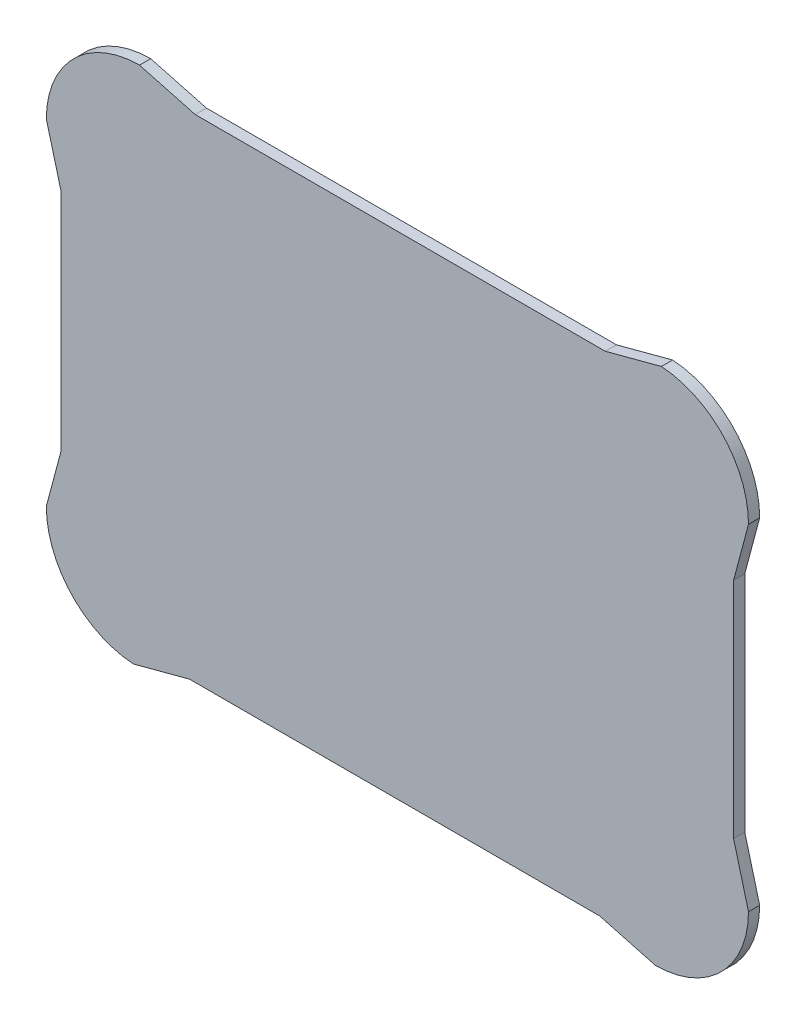
ISO-10303-21;
HEADER;
FILE_DESCRIPTION(('STEP AP214'),'2;1');
FILE_NAME('part.step','',(''),(''),'','','');
FILE_SCHEMA(('AUTOMOTIVE_DESIGN { 1 0 10303 214 1 1 1 1 }'));
ENDSEC;
DATA;
#1=APPLICATION_CONTEXT('core data for automotive mechanical design processes');
#2=APPLICATION_PROTOCOL_DEFINITION('international standard','automotive_design',2000,#1);
#3=PRODUCT_CONTEXT('',#1,'mechanical');
#4=PRODUCT('Part','Part','',(#3));
#5=PRODUCT_RELATED_PRODUCT_CATEGORY('part','',(#4));
#6=PRODUCT_DEFINITION_FORMATION('','',#4);
#7=PRODUCT_DEFINITION_CONTEXT('part definition',#1,'design');
#8=PRODUCT_DEFINITION('design','',#6,#7);
#9=PRODUCT_DEFINITION_SHAPE('','',#8);
#10=(LENGTH_UNIT() NAMED_UNIT(*) SI_UNIT(.MILLI.,.METRE.));
#11=(NAMED_UNIT(*) PLANE_ANGLE_UNIT() SI_UNIT($,.RADIAN.));
#12=(NAMED_UNIT(*) SI_UNIT($,.STERADIAN.) SOLID_ANGLE_UNIT());
#13=UNCERTAINTY_MEASURE_WITH_UNIT(LENGTH_MEASURE(1.E-05),#10,'distance_accuracy_value','');
#14=(GEOMETRIC_REPRESENTATION_CONTEXT(3) GLOBAL_UNCERTAINTY_ASSIGNED_CONTEXT((#13)) GLOBAL_UNIT_ASSIGNED_CONTEXT((#10,
#11,#12)) REPRESENTATION_CONTEXT('',''));
#15=CARTESIAN_POINT('',(0.,0.,0.));
#16=DIRECTION('',(0.,0.,1.));
#17=DIRECTION('',(1.,0.,0.));
#18=AXIS2_PLACEMENT_3D('',#15,#16,#17);
#19=CARTESIAN_POINT('',(-46.9702983450774,-73.8593226086013,6.));
#20=DIRECTION('',(0.,0.,-1.));
#21=DIRECTION('',(-1.,0.,0.));
#22=AXIS2_PLACEMENT_3D('',#19,#20,#21);
#23=CYLINDRICAL_SURFACE('',#22,50.);
#24=CARTESIAN_POINT('',(-46.9702983450774,-73.8593226086013,0.));
#25=DIRECTION('',(0.,0.,1.));
#26=DIRECTION('',(-1.,0.,0.));
#27=AXIS2_PLACEMENT_3D('',#24,#25,#26);
#28=CIRCLE('',#27,50.);
#29=CARTESIAN_POINT('',(-46.9694047117231,-123.859322600615,0.));
#30=VERTEX_POINT('',#29);
#31=CARTESIAN_POINT('',(3.02960538185109,-73.9574414033332,0.));
#32=VERTEX_POINT('',#31);
#33=EDGE_CURVE('E188',#30,#32,#28,.T.);
#34=ORIENTED_EDGE('',*,*,#33,.T.);
#35=DIRECTION('',(0.,0.,-1.));
#36=VECTOR('',#35,1.);
#37=CARTESIAN_POINT('',(3.02960538185109,-73.9574414033332,6.));
#38=LINE('',#37,#36);
#39=CARTESIAN_POINT('',(3.02960538185109,-73.9574414033332,6.));
#40=VERTEX_POINT('',#39);
#41=EDGE_CURVE('E11',#40,#32,#38,.T.);
#42=ORIENTED_EDGE('',*,*,#41,.F.);
#43=CARTESIAN_POINT('',(-46.9702983450774,-73.8593226086013,6.));
#44=DIRECTION('',(0.,0.,1.));
#45=DIRECTION('',(-1.,0.,0.));
#46=AXIS2_PLACEMENT_3D('',#43,#44,#45);
#47=CIRCLE('',#46,50.);
#48=CARTESIAN_POINT('',(-46.9694047117231,-123.859322600615,6.));
#49=VERTEX_POINT('',#48);
#50=EDGE_CURVE('E234',#49,#40,#47,.T.);
#51=ORIENTED_EDGE('',*,*,#50,.F.);
#52=DIRECTION('',(0.,0.,-1.));
#53=VECTOR('',#52,1.);
#54=CARTESIAN_POINT('',(-46.9694047117231,-123.859322600615,6.));
#55=LINE('',#54,#53);
#56=EDGE_CURVE('E184',#49,#30,#55,.T.);
#57=ORIENTED_EDGE('',*,*,#56,.T.);
#58=EDGE_LOOP('',(#34,#42,#51,#57));
#59=FACE_BOUND('',#58,.T.);
#60=ADVANCED_FACE('F39',(#59),#23,.T.);
#61=CARTESIAN_POINT('',(-4.97039461814889,-43.9574414033332,6.));
#62=DIRECTION('',(-0.966234939601246,-0.257662650560332,0.));
#63=DIRECTION('',(0.257662650560332,-0.966234939601247,0.));
#64=AXIS2_PLACEMENT_3D('',#61,#62,#63);
#65=PLANE('',#64);
#66=DIRECTION('',(-0.257662650560332,0.966234939601247,0.));
#67=VECTOR('',#66,1.);
#68=CARTESIAN_POINT('',(-4.97039461814889,-43.9574414033332,0.));
#69=LINE('',#68,#67);
#70=CARTESIAN_POINT('',(-4.97039461814889,-43.9574414033332,0.));
#71=VERTEX_POINT('',#70);
#72=EDGE_CURVE('E192',#32,#71,#69,.T.);
#73=ORIENTED_EDGE('',*,*,#72,.T.);
#74=DIRECTION('',(0.,0.,-1.));
#75=VECTOR('',#74,1.);
#76=CARTESIAN_POINT('',(-4.97039461814889,-43.9574414033332,6.));
#77=LINE('',#76,#75);
#78=CARTESIAN_POINT('',(-4.97039461814889,-43.9574414033332,6.));
#79=VERTEX_POINT('',#78);
#80=EDGE_CURVE('E48',#79,#71,#77,.T.);
#81=ORIENTED_EDGE('',*,*,#80,.F.);
#82=DIRECTION('',(-0.257662650560332,0.966234939601247,0.));
#83=VECTOR('',#82,1.);
#84=CARTESIAN_POINT('',(-4.97039461814889,-43.9574414033332,6.));
#85=LINE('',#84,#83);
#86=EDGE_CURVE('E123',#40,#79,#85,.T.);
#87=ORIENTED_EDGE('',*,*,#86,.F.);
#88=ORIENTED_EDGE('',*,*,#41,.T.);
#89=EDGE_LOOP('',(#73,#81,#87,#88));
#90=FACE_BOUND('',#89,.T.);
#91=ADVANCED_FACE('F356',(#90),#65,.F.);
#92=CARTESIAN_POINT('',(-4.97039461814891,76.0425585966668,6.));
#93=DIRECTION('',(-1.,0.,0.));
#94=DIRECTION('',(0.,-1.,0.));
#95=AXIS2_PLACEMENT_3D('',#92,#93,#94);
#96=PLANE('',#95);
#97=DIRECTION('',(0.,1.,0.));
#98=VECTOR('',#97,1.);
#99=CARTESIAN_POINT('',(-4.97039461814891,76.0425585966668,0.));
#100=LINE('',#99,#98);
#101=CARTESIAN_POINT('',(-4.97039461814891,76.0425585966668,0.));
#102=VERTEX_POINT('',#101);
#103=EDGE_CURVE('E195',#71,#102,#100,.T.);
#104=ORIENTED_EDGE('',*,*,#103,.T.);
#105=DIRECTION('',(0.,0.,-1.));
#106=VECTOR('',#105,1.);
#107=CARTESIAN_POINT('',(-4.97039461814891,76.0425585966668,6.));
#108=LINE('',#107,#106);
#109=CARTESIAN_POINT('',(-4.97039461814891,76.0425585966668,6.));
#110=VERTEX_POINT('',#109);
#111=EDGE_CURVE('E277',#110,#102,#108,.T.);
#112=ORIENTED_EDGE('',*,*,#111,.F.);
#113=DIRECTION('',(0.,1.,0.));
#114=VECTOR('',#113,1.);
#115=CARTESIAN_POINT('',(-4.97039461814891,76.0425585966668,6.));
#116=LINE('',#115,#114);
#117=EDGE_CURVE('E287',#79,#110,#116,.T.);
#118=ORIENTED_EDGE('',*,*,#117,.F.);
#119=ORIENTED_EDGE('',*,*,#80,.T.);
#120=EDGE_LOOP('',(#104,#112,#118,#119));
#121=FACE_BOUND('',#120,.T.);
#122=ADVANCED_FACE('F285',(#121),#96,.F.);
#123=CARTESIAN_POINT('',(3.02960538185109,106.042558596667,6.));
#124=DIRECTION('',(-0.966234939601246,0.257662650560332,0.));
#125=DIRECTION('',(-0.257662650560332,-0.966234939601246,0.));
#126=AXIS2_PLACEMENT_3D('',#123,#124,#125);
#127=PLANE('',#126);
#128=DIRECTION('',(0.257662650560332,0.966234939601246,0.));
#129=VECTOR('',#128,1.);
#130=CARTESIAN_POINT('',(3.02960538185109,106.042558596667,0.));
#131=LINE('',#130,#129);
#132=CARTESIAN_POINT('',(3.02960538185109,106.042558596667,0.));
#133=VERTEX_POINT('',#132);
#134=EDGE_CURVE('E198',#102,#133,#131,.T.);
#135=ORIENTED_EDGE('',*,*,#134,.T.);
#136=DIRECTION('',(0.,0.,-1.));
#137=VECTOR('',#136,1.);
#138=CARTESIAN_POINT('',(3.02960538185109,106.042558596667,6.));
#139=LINE('',#138,#137);
#140=CARTESIAN_POINT('',(3.02960538185109,106.042558596667,6.));
#141=VERTEX_POINT('',#140);
#142=EDGE_CURVE('E273',#141,#133,#139,.T.);
#143=ORIENTED_EDGE('',*,*,#142,.F.);
#144=DIRECTION('',(0.257662650560332,0.966234939601246,0.));
#145=VECTOR('',#144,1.);
#146=CARTESIAN_POINT('',(3.02960538185109,106.042558596667,6.));
#147=LINE('',#146,#145);
#148=EDGE_CURVE('E306',#110,#141,#147,.T.);
#149=ORIENTED_EDGE('',*,*,#148,.F.);
#150=ORIENTED_EDGE('',*,*,#111,.T.);
#151=EDGE_LOOP('',(#135,#143,#149,#150));
#152=FACE_BOUND('',#151,.T.);
#153=ADVANCED_FACE('F296',(#152),#127,.F.);
#154=CARTESIAN_POINT('',(-46.9702961918436,106.141768580257,6.));
#155=DIRECTION('',(0.,0.,-1.));
#156=DIRECTION('',(-1.,0.,0.));
#157=AXIS2_PLACEMENT_3D('',#154,#155,#156);
#158=CYLINDRICAL_SURFACE('',#157,50.);
#159=CARTESIAN_POINT('',(-46.9702961918436,106.141768580257,0.));
#160=DIRECTION('',(0.,0.,1.));
#161=DIRECTION('',(1.,0.,0.));
#162=AXIS2_PLACEMENT_3D('',#159,#160,#161);
#163=CIRCLE('',#162,50.);
#164=CARTESIAN_POINT('',(-43.6970237069782,156.034510409503,0.));
#165=VERTEX_POINT('',#164);
#166=EDGE_CURVE('E201',#133,#165,#163,.T.);
#167=ORIENTED_EDGE('',*,*,#166,.T.);
#168=DIRECTION('',(0.,0.,-1.));
#169=VECTOR('',#168,1.);
#170=CARTESIAN_POINT('',(-43.6970237069782,156.034510409503,6.));
#171=LINE('',#170,#169);
#172=CARTESIAN_POINT('',(-43.6970237069782,156.034510409503,6.));
#173=VERTEX_POINT('',#172);
#174=EDGE_CURVE('E269',#173,#165,#171,.T.);
#175=ORIENTED_EDGE('',*,*,#174,.F.);
#176=CARTESIAN_POINT('',(-46.9702961918436,106.141768580257,6.));
#177=DIRECTION('',(0.,0.,1.));
#178=DIRECTION('',(1.,0.,0.));
#179=AXIS2_PLACEMENT_3D('',#176,#177,#178);
#180=CIRCLE('',#179,50.);
#181=EDGE_CURVE('E302',#141,#173,#180,.T.);
#182=ORIENTED_EDGE('',*,*,#181,.F.);
#183=ORIENTED_EDGE('',*,*,#142,.T.);
#184=EDGE_LOOP('',(#167,#175,#182,#183));
#185=FACE_BOUND('',#184,.T.);
#186=ADVANCED_FACE('F300',(#185),#158,.T.);
#187=CARTESIAN_POINT('',(-73.7905493796056,148.035057118899,6.));
#188=DIRECTION('',(0.256898411546572,-0.966438413011842,0.));
#189=DIRECTION('',(0.966438413011842,0.256898411546572,0.));
#190=AXIS2_PLACEMENT_3D('',#187,#188,#189);
#191=PLANE('',#190);
#192=DIRECTION('',(-0.966438413011842,-0.256898411546572,0.));
#193=VECTOR('',#192,1.);
#194=CARTESIAN_POINT('',(-73.7905493796056,148.035057118899,0.));
#195=LINE('',#194,#193);
#196=CARTESIAN_POINT('',(-73.7905493796056,148.035057118899,0.));
#197=VERTEX_POINT('',#196);
#198=EDGE_CURVE('E204',#165,#197,#195,.T.);
#199=ORIENTED_EDGE('',*,*,#198,.T.);
#200=DIRECTION('',(0.,0.,-1.));
#201=VECTOR('',#200,1.);
#202=CARTESIAN_POINT('',(-73.7905493796056,148.035057118899,6.));
#203=LINE('',#202,#201);
#204=CARTESIAN_POINT('',(-73.7905493796056,148.035057118899,6.));
#205=VERTEX_POINT('',#204);
#206=EDGE_CURVE('E265',#205,#197,#203,.T.);
#207=ORIENTED_EDGE('',*,*,#206,.F.);
#208=DIRECTION('',(-0.966438413011842,-0.256898411546572,0.));
#209=VECTOR('',#208,1.);
#210=CARTESIAN_POINT('',(-73.7905493796056,148.035057118899,6.));
#211=LINE('',#210,#209);
#212=EDGE_CURVE('E305',#173,#205,#211,.T.);
#213=ORIENTED_EDGE('',*,*,#212,.F.);
#214=ORIENTED_EDGE('',*,*,#174,.T.);
#215=EDGE_LOOP('',(#199,#207,#213,#214));
#216=FACE_BOUND('',#215,.T.);
#217=ADVANCED_FACE('F369',(#216),#191,.F.);
#218=CARTESIAN_POINT('',(-293.790549379606,148.035057118899,6.));
#219=DIRECTION('',(0.,-1.,0.));
#220=DIRECTION('',(0.,0.,-1.));
#221=AXIS2_PLACEMENT_3D('',#218,#219,#220);
#222=PLANE('',#221);
#223=DIRECTION('',(-1.,0.,0.));
#224=VECTOR('',#223,1.);
#225=CARTESIAN_POINT('',(-293.790549379606,148.035057118899,0.));
#226=LINE('',#225,#224);
#227=CARTESIAN_POINT('',(-293.790549379606,148.035057118899,0.));
#228=VERTEX_POINT('',#227);
#229=EDGE_CURVE('E207',#197,#228,#226,.T.);
#230=ORIENTED_EDGE('',*,*,#229,.T.);
#231=DIRECTION('',(0.,0.,-1.));
#232=VECTOR('',#231,1.);
#233=CARTESIAN_POINT('',(-293.790549379606,148.035057118899,6.));
#234=LINE('',#233,#232);
#235=CARTESIAN_POINT('',(-293.790549379606,148.035057118899,6.));
#236=VERTEX_POINT('',#235);
#237=EDGE_CURVE('E261',#236,#228,#234,.T.);
#238=ORIENTED_EDGE('',*,*,#237,.F.);
#239=DIRECTION('',(-1.,0.,0.));
#240=VECTOR('',#239,1.);
#241=CARTESIAN_POINT('',(-293.790549379606,148.035057118899,6.));
#242=LINE('',#241,#240);
#243=EDGE_CURVE('E310',#205,#236,#242,.T.);
#244=ORIENTED_EDGE('',*,*,#243,.F.);
#245=ORIENTED_EDGE('',*,*,#206,.T.);
#246=EDGE_LOOP('',(#230,#238,#244,#245));
#247=FACE_BOUND('',#246,.T.);
#248=ADVANCED_FACE('F372',(#247),#222,.F.);
#249=CARTESIAN_POINT('',(-323.697023706978,156.034510409503,6.));
#250=DIRECTION('',(-0.258398220854129,-0.966038487566319,0.));
#251=DIRECTION('',(0.966038487566319,-0.258398220854129,0.));
#252=AXIS2_PLACEMENT_3D('',#249,#250,#251);
#253=PLANE('',#252);
#254=DIRECTION('',(-0.966038487566319,0.258398220854129,0.));
#255=VECTOR('',#254,1.);
#256=CARTESIAN_POINT('',(-323.697023706978,156.034510409503,0.));
#257=LINE('',#256,#255);
#258=CARTESIAN_POINT('',(-323.697023706978,156.034510409503,0.));
#259=VERTEX_POINT('',#258);
#260=EDGE_CURVE('E210',#228,#259,#257,.T.);
#261=ORIENTED_EDGE('',*,*,#260,.T.);
#262=DIRECTION('',(0.,0.,-1.));
#263=VECTOR('',#262,1.);
#264=CARTESIAN_POINT('',(-323.697023706978,156.034510409503,6.));
#265=LINE('',#264,#263);
#266=CARTESIAN_POINT('',(-323.697023706978,156.034510409503,6.));
#267=VERTEX_POINT('',#266);
#268=EDGE_CURVE('E257',#267,#259,#265,.T.);
#269=ORIENTED_EDGE('',*,*,#268,.F.);
#270=DIRECTION('',(-0.966038487566319,0.258398220854129,0.));
#271=VECTOR('',#270,1.);
#272=CARTESIAN_POINT('',(-323.697023706978,156.034510409503,6.));
#273=LINE('',#272,#271);
#274=EDGE_CURVE('E317',#236,#267,#273,.T.);
#275=ORIENTED_EDGE('',*,*,#274,.F.);
#276=ORIENTED_EDGE('',*,*,#237,.T.);
#277=EDGE_LOOP('',(#261,#269,#275,#276));
#278=FACE_BOUND('',#277,.T.);
#279=ADVANCED_FACE('F376',(#278),#253,.F.);
#280=CARTESIAN_POINT('',(-323.694675277693,106.034510464654,6.));
#281=DIRECTION('',(0.,0.,-1.));
#282=DIRECTION('',(-1.,0.,0.));
#283=AXIS2_PLACEMENT_3D('',#280,#281,#282);
#284=CYLINDRICAL_SURFACE('',#283,50.);
#285=CARTESIAN_POINT('',(-323.694675277693,106.034510464654,0.));
#286=DIRECTION('',(0.,0.,1.));
#287=DIRECTION('',(1.,0.,0.));
#288=AXIS2_PLACEMENT_3D('',#285,#286,#287);
#289=CIRCLE('',#288,50.);
#290=CARTESIAN_POINT('',(-373.694674629968,106.042558596667,0.));
#291=VERTEX_POINT('',#290);
#292=EDGE_CURVE('E213',#259,#291,#289,.T.);
#293=ORIENTED_EDGE('',*,*,#292,.T.);
#294=DIRECTION('',(0.,0.,-1.));
#295=VECTOR('',#294,1.);
#296=CARTESIAN_POINT('',(-373.694674629968,106.042558596667,6.));
#297=LINE('',#296,#295);
#298=CARTESIAN_POINT('',(-373.694674629968,106.042558596667,6.));
#299=VERTEX_POINT('',#298);
#300=EDGE_CURVE('E253',#299,#291,#297,.T.);
#301=ORIENTED_EDGE('',*,*,#300,.F.);
#302=CARTESIAN_POINT('',(-323.694675277693,106.034510464654,6.));
#303=DIRECTION('',(0.,0.,1.));
#304=DIRECTION('',(1.,0.,0.));
#305=AXIS2_PLACEMENT_3D('',#302,#303,#304);
#306=CIRCLE('',#305,50.);
#307=EDGE_CURVE('E320',#267,#299,#306,.T.);
#308=ORIENTED_EDGE('',*,*,#307,.F.);
#309=ORIENTED_EDGE('',*,*,#268,.T.);
#310=EDGE_LOOP('',(#293,#301,#308,#309));
#311=FACE_BOUND('',#310,.T.);
#312=ADVANCED_FACE('F380',(#311),#284,.T.);
#313=CARTESIAN_POINT('',(-373.694674629968,106.042558596667,6.));
#314=DIRECTION('',(0.966234939601247,0.257662650560331,0.));
#315=DIRECTION('',(-0.257662650560331,0.966234939601247,0.));
#316=AXIS2_PLACEMENT_3D('',#313,#314,#315);
#317=PLANE('',#316);
#318=DIRECTION('',(0.257662650560331,-0.966234939601247,0.));
#319=VECTOR('',#318,1.);
#320=CARTESIAN_POINT('',(-373.694674629968,106.042558596667,0.));
#321=LINE('',#320,#319);
#322=CARTESIAN_POINT('',(-365.694674629968,76.0425585966668,0.));
#323=VERTEX_POINT('',#322);
#324=EDGE_CURVE('E216',#291,#323,#321,.T.);
#325=ORIENTED_EDGE('',*,*,#324,.T.);
#326=DIRECTION('',(0.,0.,-1.));
#327=VECTOR('',#326,1.);
#328=CARTESIAN_POINT('',(-365.694674629968,76.0425585966668,6.));
#329=LINE('',#328,#327);
#330=CARTESIAN_POINT('',(-365.694674629968,76.0425585966668,6.));
#331=VERTEX_POINT('',#330);
#332=EDGE_CURVE('E249',#331,#323,#329,.T.);
#333=ORIENTED_EDGE('',*,*,#332,.F.);
#334=DIRECTION('',(0.257662650560331,-0.966234939601247,0.));
#335=VECTOR('',#334,1.);
#336=CARTESIAN_POINT('',(-373.694674629968,106.042558596667,6.));
#337=LINE('',#336,#335);
#338=EDGE_CURVE('E323',#299,#331,#337,.T.);
#339=ORIENTED_EDGE('',*,*,#338,.F.);
#340=ORIENTED_EDGE('',*,*,#300,.T.);
#341=EDGE_LOOP('',(#325,#333,#339,#340));
#342=FACE_BOUND('',#341,.T.);
#343=ADVANCED_FACE('F384',(#342),#317,.F.);
#344=CARTESIAN_POINT('',(-365.694674629968,76.0425585966668,6.));
#345=DIRECTION('',(1.,0.,0.));
#346=DIRECTION('',(0.,0.,-1.));
#347=AXIS2_PLACEMENT_3D('',#344,#345,#346);
#348=PLANE('',#347);
#349=DIRECTION('',(0.,-1.,0.));
#350=VECTOR('',#349,1.);
#351=CARTESIAN_POINT('',(-365.694674629968,76.0425585966668,0.));
#352=LINE('',#351,#350);
#353=CARTESIAN_POINT('',(-365.694674629968,-43.9574414033332,0.));
#354=VERTEX_POINT('',#353);
#355=EDGE_CURVE('E219',#323,#354,#352,.T.);
#356=ORIENTED_EDGE('',*,*,#355,.T.);
#357=DIRECTION('',(0.,0.,-1.));
#358=VECTOR('',#357,1.);
#359=CARTESIAN_POINT('',(-365.694674629968,-43.9574414033332,6.));
#360=LINE('',#359,#358);
#361=CARTESIAN_POINT('',(-365.694674629968,-43.9574414033332,6.));
#362=VERTEX_POINT('',#361);
#363=EDGE_CURVE('E245',#362,#354,#360,.T.);
#364=ORIENTED_EDGE('',*,*,#363,.F.);
#365=DIRECTION('',(0.,-1.,0.));
#366=VECTOR('',#365,1.);
#367=CARTESIAN_POINT('',(-365.694674629968,76.0425585966668,6.));
#368=LINE('',#367,#366);
#369=EDGE_CURVE('E326',#331,#362,#368,.T.);
#370=ORIENTED_EDGE('',*,*,#369,.F.);
#371=ORIENTED_EDGE('',*,*,#332,.T.);
#372=EDGE_LOOP('',(#356,#364,#370,#371));
#373=FACE_BOUND('',#372,.T.);
#374=ADVANCED_FACE('F388',(#373),#348,.F.);
#375=CARTESIAN_POINT('',(-365.694674629968,-43.9574414033332,6.));
#376=DIRECTION('',(0.966234939601246,-0.257662650560333,0.));
#377=DIRECTION('',(0.257662650560333,0.966234939601246,0.));
#378=AXIS2_PLACEMENT_3D('',#375,#376,#377);
#379=PLANE('',#378);
#380=DIRECTION('',(-0.257662650560333,-0.966234939601246,0.));
#381=VECTOR('',#380,1.);
#382=CARTESIAN_POINT('',(-365.694674629968,-43.9574414033332,0.));
#383=LINE('',#382,#381);
#384=CARTESIAN_POINT('',(-373.694674629968,-73.9574414033332,0.));
#385=VERTEX_POINT('',#384);
#386=EDGE_CURVE('E222',#354,#385,#383,.T.);
#387=ORIENTED_EDGE('',*,*,#386,.T.);
#388=DIRECTION('',(0.,0.,-1.));
#389=VECTOR('',#388,1.);
#390=CARTESIAN_POINT('',(-373.694674629968,-73.9574414033332,6.));
#391=LINE('',#390,#389);
#392=CARTESIAN_POINT('',(-373.694674629968,-73.9574414033332,6.));
#393=VERTEX_POINT('',#392);
#394=EDGE_CURVE('E241',#393,#385,#391,.T.);
#395=ORIENTED_EDGE('',*,*,#394,.F.);
#396=DIRECTION('',(-0.257662650560333,-0.966234939601246,0.));
#397=VECTOR('',#396,1.);
#398=CARTESIAN_POINT('',(-365.694674629968,-43.9574414033332,6.));
#399=LINE('',#398,#397);
#400=EDGE_CURVE('E329',#362,#393,#399,.T.);
#401=ORIENTED_EDGE('',*,*,#400,.F.);
#402=ORIENTED_EDGE('',*,*,#363,.T.);
#403=EDGE_LOOP('',(#387,#395,#401,#402));
#404=FACE_BOUND('',#403,.T.);
#405=ADVANCED_FACE('F337',(#404),#379,.F.);
#406=CARTESIAN_POINT('',(-323.694675482814,-73.9666763641477,6.));
#407=DIRECTION('',(0.,0.,-1.));
#408=DIRECTION('',(-1.,0.,0.));
#409=AXIS2_PLACEMENT_3D('',#406,#407,#408);
#410=CYLINDRICAL_SURFACE('',#409,50.);
#411=CARTESIAN_POINT('',(-323.694675482814,-73.9666763641477,0.));
#412=DIRECTION('',(0.,0.,1.));
#413=DIRECTION('',(1.,0.,0.));
#414=AXIS2_PLACEMENT_3D('',#411,#412,#413);
#415=CIRCLE('',#414,50.);
#416=CARTESIAN_POINT('',(-326.969404711724,-123.859322600615,0.));
#417=VERTEX_POINT('',#416);
#418=EDGE_CURVE('E225',#385,#417,#415,.T.);
#419=ORIENTED_EDGE('',*,*,#418,.T.);
#420=DIRECTION('',(0.,0.,-1.));
#421=VECTOR('',#420,1.);
#422=CARTESIAN_POINT('',(-326.969404711724,-123.859322600615,6.));
#423=LINE('',#422,#421);
#424=CARTESIAN_POINT('',(-326.969404711724,-123.859322600615,6.));
#425=VERTEX_POINT('',#424);
#426=EDGE_CURVE('E177',#425,#417,#423,.T.);
#427=ORIENTED_EDGE('',*,*,#426,.F.);
#428=CARTESIAN_POINT('',(-323.694675482814,-73.9666763641477,6.));
#429=DIRECTION('',(0.,0.,1.));
#430=DIRECTION('',(1.,0.,0.));
#431=AXIS2_PLACEMENT_3D('',#428,#429,#430);
#432=CIRCLE('',#431,50.);
#433=EDGE_CURVE('E166',#393,#425,#432,.T.);
#434=ORIENTED_EDGE('',*,*,#433,.F.);
#435=ORIENTED_EDGE('',*,*,#394,.T.);
#436=EDGE_LOOP('',(#419,#427,#434,#435));
#437=FACE_BOUND('',#436,.T.);
#438=ADVANCED_FACE('F341',(#437),#410,.T.);
#439=CARTESIAN_POINT('',(-326.969404711724,-123.859322600615,6.));
#440=DIRECTION('',(-0.256898411546573,0.966438413011842,0.));
#441=DIRECTION('',(-0.966438413011842,-0.256898411546573,0.));
#442=AXIS2_PLACEMENT_3D('',#439,#440,#441);
#443=PLANE('',#442);
#444=DIRECTION('',(0.966438413011842,0.256898411546573,0.));
#445=VECTOR('',#444,1.);
#446=CARTESIAN_POINT('',(-326.969404711724,-123.859322600615,0.));
#447=LINE('',#446,#445);
#448=CARTESIAN_POINT('',(-296.875879039097,-115.859869310011,0.));
#449=VERTEX_POINT('',#448);
#450=EDGE_CURVE('E175',#417,#449,#447,.T.);
#451=ORIENTED_EDGE('',*,*,#450,.T.);
#452=DIRECTION('',(0.,0.,-1.));
#453=VECTOR('',#452,1.);
#454=CARTESIAN_POINT('',(-296.875879039097,-115.859869310011,6.));
#455=LINE('',#454,#453);
#456=CARTESIAN_POINT('',(-296.875879039097,-115.859869310011,6.));
#457=VERTEX_POINT('',#456);
#458=EDGE_CURVE('E172',#457,#449,#455,.T.);
#459=ORIENTED_EDGE('',*,*,#458,.F.);
#460=DIRECTION('',(0.966438413011842,0.256898411546573,0.));
#461=VECTOR('',#460,1.);
#462=CARTESIAN_POINT('',(-326.969404711724,-123.859322600615,6.));
#463=LINE('',#462,#461);
#464=EDGE_CURVE('E160',#425,#457,#463,.T.);
#465=ORIENTED_EDGE('',*,*,#464,.F.);
#466=ORIENTED_EDGE('',*,*,#426,.T.);
#467=EDGE_LOOP('',(#451,#459,#465,#466));
#468=FACE_BOUND('',#467,.T.);
#469=ADVANCED_FACE('F173',(#468),#443,.F.);
#470=CARTESIAN_POINT('',(-296.875879039097,-115.859869310011,6.));
#471=DIRECTION('',(0.,1.,0.));
#472=DIRECTION('',(0.,0.,1.));
#473=AXIS2_PLACEMENT_3D('',#470,#471,#472);
#474=PLANE('',#473);
#475=DIRECTION('',(1.,0.,0.));
#476=VECTOR('',#475,1.);
#477=CARTESIAN_POINT('',(-296.875879039097,-115.859869310011,0.));
#478=LINE('',#477,#476);
#479=CARTESIAN_POINT('',(-76.8758790390971,-115.859869310011,0.));
#480=VERTEX_POINT('',#479);
#481=EDGE_CURVE('E109',#449,#480,#478,.T.);
#482=ORIENTED_EDGE('',*,*,#481,.T.);
#483=DIRECTION('',(0.,0.,-1.));
#484=VECTOR('',#483,1.);
#485=CARTESIAN_POINT('',(-76.8758790390971,-115.859869310011,6.));
#486=LINE('',#485,#484);
#487=CARTESIAN_POINT('',(-76.8758790390971,-115.859869310011,6.));
#488=VERTEX_POINT('',#487);
#489=EDGE_CURVE('E178',#488,#480,#486,.T.);
#490=ORIENTED_EDGE('',*,*,#489,.F.);
#491=DIRECTION('',(1.,0.,0.));
#492=VECTOR('',#491,1.);
#493=CARTESIAN_POINT('',(-296.875879039097,-115.859869310011,6.));
#494=LINE('',#493,#492);
#495=EDGE_CURVE('E164',#457,#488,#494,.T.);
#496=ORIENTED_EDGE('',*,*,#495,.F.);
#497=ORIENTED_EDGE('',*,*,#458,.T.);
#498=EDGE_LOOP('',(#482,#490,#496,#497));
#499=FACE_BOUND('',#498,.T.);
#500=ADVANCED_FACE('F180',(#499),#474,.F.);
#501=CARTESIAN_POINT('',(-76.8758790390971,-115.859869310011,6.));
#502=DIRECTION('',(0.258398220854119,0.966038487566322,0.));
#503=DIRECTION('',(-0.966038487566322,0.258398220854119,0.));
#504=AXIS2_PLACEMENT_3D('',#501,#502,#503);
#505=PLANE('',#504);
#506=DIRECTION('',(0.966038487566321,-0.258398220854119,0.));
#507=VECTOR('',#506,1.);
#508=CARTESIAN_POINT('',(-76.8758790390971,-115.859869310011,0.));
#509=LINE('',#508,#507);
#510=EDGE_CURVE('E115',#480,#30,#509,.T.);
#511=ORIENTED_EDGE('',*,*,#510,.T.);
#512=ORIENTED_EDGE('',*,*,#56,.F.);
#513=DIRECTION('',(0.966038487566321,-0.258398220854119,0.));
#514=VECTOR('',#513,1.);
#515=CARTESIAN_POINT('',(-76.8758790390971,-115.859869310011,6.));
#516=LINE('',#515,#514);
#517=EDGE_CURVE('E56',#488,#49,#516,.T.);
#518=ORIENTED_EDGE('',*,*,#517,.F.);
#519=ORIENTED_EDGE('',*,*,#489,.T.);
#520=EDGE_LOOP('',(#511,#512,#518,#519));
#521=FACE_BOUND('',#520,.T.);
#522=ADVANCED_FACE('F345',(#521),#505,.F.);
#523=CARTESIAN_POINT('',(-46.9702983450774,-73.8593226086013,6.));
#524=DIRECTION('',(0.,0.,-1.));
#525=DIRECTION('',(-1.,0.,0.));
#526=AXIS2_PLACEMENT_3D('',#523,#524,#525);
#527=PLANE('',#526);
#528=ORIENTED_EDGE('',*,*,#50,.T.);
#529=ORIENTED_EDGE('',*,*,#86,.T.);
#530=ORIENTED_EDGE('',*,*,#117,.T.);
#531=ORIENTED_EDGE('',*,*,#148,.T.);
#532=ORIENTED_EDGE('',*,*,#181,.T.);
#533=ORIENTED_EDGE('',*,*,#212,.T.);
#534=ORIENTED_EDGE('',*,*,#243,.T.);
#535=ORIENTED_EDGE('',*,*,#274,.T.);
#536=ORIENTED_EDGE('',*,*,#307,.T.);
#537=ORIENTED_EDGE('',*,*,#338,.T.);
#538=ORIENTED_EDGE('',*,*,#369,.T.);
#539=ORIENTED_EDGE('',*,*,#400,.T.);
#540=ORIENTED_EDGE('',*,*,#433,.T.);
#541=ORIENTED_EDGE('',*,*,#464,.T.);
#542=ORIENTED_EDGE('',*,*,#495,.T.);
#543=ORIENTED_EDGE('',*,*,#517,.T.);
#544=EDGE_LOOP('',(#528,#529,#530,#531,#532,#533,#534,#535,#536,#537,#538,#539,#540,#541,#542,#543));
#545=FACE_BOUND('',#544,.T.);
#546=ADVANCED_FACE('F162',(#545),#527,.F.);
#547=CARTESIAN_POINT('',(-46.9702983450774,-73.8593226086013,0.));
#548=DIRECTION('',(0.,0.,-1.));
#549=DIRECTION('',(-1.,0.,0.));
#550=AXIS2_PLACEMENT_3D('',#547,#548,#549);
#551=PLANE('',#550);
#552=ORIENTED_EDGE('',*,*,#33,.F.);
#553=ORIENTED_EDGE('',*,*,#510,.F.);
#554=ORIENTED_EDGE('',*,*,#481,.F.);
#555=ORIENTED_EDGE('',*,*,#450,.F.);
#556=ORIENTED_EDGE('',*,*,#418,.F.);
#557=ORIENTED_EDGE('',*,*,#386,.F.);
#558=ORIENTED_EDGE('',*,*,#355,.F.);
#559=ORIENTED_EDGE('',*,*,#324,.F.);
#560=ORIENTED_EDGE('',*,*,#292,.F.);
#561=ORIENTED_EDGE('',*,*,#260,.F.);
#562=ORIENTED_EDGE('',*,*,#229,.F.);
#563=ORIENTED_EDGE('',*,*,#198,.F.);
#564=ORIENTED_EDGE('',*,*,#166,.F.);
#565=ORIENTED_EDGE('',*,*,#134,.F.);
#566=ORIENTED_EDGE('',*,*,#103,.F.);
#567=ORIENTED_EDGE('',*,*,#72,.F.);
#568=EDGE_LOOP('',(#552,#553,#554,#555,#556,#557,#558,#559,#560,#561,#562,#563,#564,#565,#566,#567));
#569=FACE_BOUND('',#568,.T.);
#570=ADVANCED_FACE('F291',(#569),#551,.T.);
#571=CLOSED_SHELL('',(#60,#91,#122,#153,#186,#217,#248,#279,#312,#343,#374,#405,#438,#469,#500,
#522,#546,#570));
#572=MANIFOLD_SOLID_BREP('B2',#571);
#573=ADVANCED_BREP_SHAPE_REPRESENTATION('',(#18,#572),#14);
#574=SHAPE_DEFINITION_REPRESENTATION(#9,#573);
ENDSEC;
END-ISO-10303-21;
